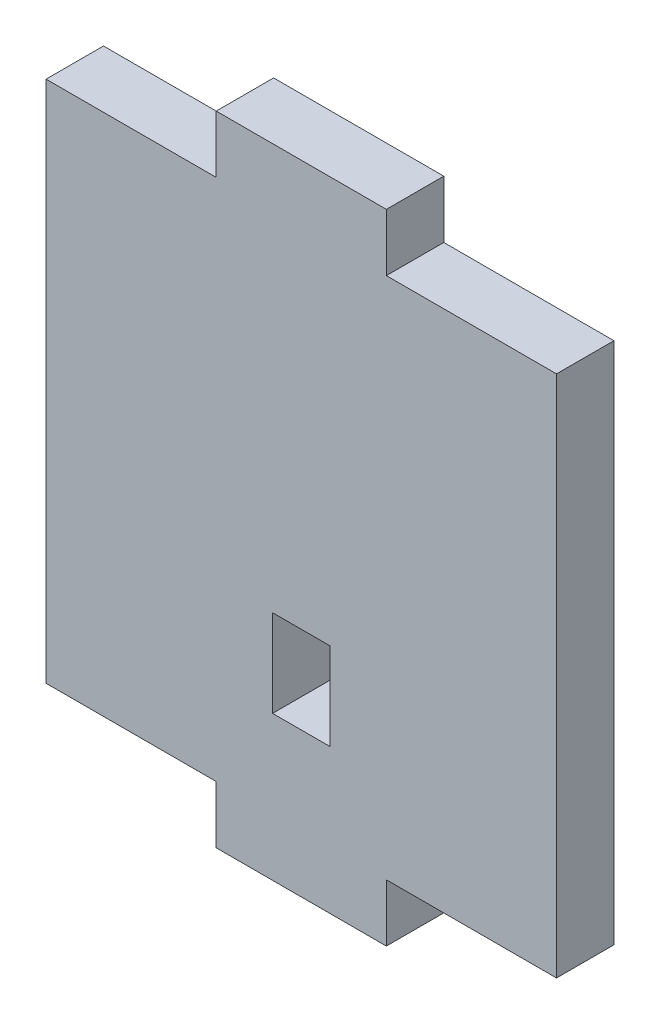
ISO-10303-21;
HEADER;
FILE_DESCRIPTION(('STEP AP214'),'2;1');
FILE_NAME('part.step','',(''),(''),'','','');
FILE_SCHEMA(('AUTOMOTIVE_DESIGN { 1 0 10303 214 1 1 1 1 }'));
ENDSEC;
DATA;
#1=APPLICATION_CONTEXT('core data for automotive mechanical design processes');
#2=APPLICATION_PROTOCOL_DEFINITION('international standard','automotive_design',2000,#1);
#3=PRODUCT_CONTEXT('',#1,'mechanical');
#4=PRODUCT('Part','Part','',(#3));
#5=PRODUCT_RELATED_PRODUCT_CATEGORY('part','',(#4));
#6=PRODUCT_DEFINITION_FORMATION('','',#4);
#7=PRODUCT_DEFINITION_CONTEXT('part definition',#1,'design');
#8=PRODUCT_DEFINITION('design','',#6,#7);
#9=PRODUCT_DEFINITION_SHAPE('','',#8);
#10=(LENGTH_UNIT() NAMED_UNIT(*) SI_UNIT(.MILLI.,.METRE.));
#11=(NAMED_UNIT(*) PLANE_ANGLE_UNIT() SI_UNIT($,.RADIAN.));
#12=(NAMED_UNIT(*) SI_UNIT($,.STERADIAN.) SOLID_ANGLE_UNIT());
#13=UNCERTAINTY_MEASURE_WITH_UNIT(LENGTH_MEASURE(1.E-05),#10,'distance_accuracy_value','');
#14=(GEOMETRIC_REPRESENTATION_CONTEXT(3) GLOBAL_UNCERTAINTY_ASSIGNED_CONTEXT((#13)) GLOBAL_UNIT_ASSIGNED_CONTEXT((#10,
#11,#12)) REPRESENTATION_CONTEXT('',''));
#15=CARTESIAN_POINT('',(0.,0.,0.));
#16=DIRECTION('',(0.,0.,1.));
#17=DIRECTION('',(1.,0.,0.));
#18=AXIS2_PLACEMENT_3D('',#15,#16,#17);
#19=CARTESIAN_POINT('',(0.,36.3333333333334,9.00000000000001));
#20=DIRECTION('',(0.,1.,0.));
#21=DIRECTION('',(0.,0.,1.));
#22=AXIS2_PLACEMENT_3D('',#19,#20,#21);
#23=PLANE('',#22);
#24=DIRECTION('',(1.,0.,0.));
#25=VECTOR('',#24,1.);
#26=CARTESIAN_POINT('',(0.,36.3333333333334,0.));
#27=LINE('',#26,#25);
#28=CARTESIAN_POINT('',(35.5000000000001,36.3333333333334,0.));
#29=VERTEX_POINT('',#28);
#30=CARTESIAN_POINT('',(44.5000000000001,36.3333333333334,0.));
#31=VERTEX_POINT('',#30);
#32=EDGE_CURVE('E232',#29,#31,#27,.T.);
#33=ORIENTED_EDGE('',*,*,#32,.T.);
#34=DIRECTION('',(0.,0.,-1.));
#35=VECTOR('',#34,1.);
#36=CARTESIAN_POINT('',(44.5000000000001,36.3333333333334,9.00000000000001));
#37=LINE('',#36,#35);
#38=CARTESIAN_POINT('',(44.5000000000001,36.3333333333334,9.00000000000001));
#39=VERTEX_POINT('',#38);
#40=EDGE_CURVE('E11',#39,#31,#37,.T.);
#41=ORIENTED_EDGE('',*,*,#40,.F.);
#42=DIRECTION('',(1.,0.,0.));
#43=VECTOR('',#42,1.);
#44=CARTESIAN_POINT('',(0.,36.3333333333334,9.00000000000001));
#45=LINE('',#44,#43);
#46=CARTESIAN_POINT('',(35.5000000000001,36.3333333333334,9.00000000000001));
#47=VERTEX_POINT('',#46);
#48=EDGE_CURVE('E170',#47,#39,#45,.T.);
#49=ORIENTED_EDGE('',*,*,#48,.F.);
#50=DIRECTION('',(0.,0.,-1.));
#51=VECTOR('',#50,1.);
#52=CARTESIAN_POINT('',(35.5000000000001,36.3333333333334,9.00000000000001));
#53=LINE('',#52,#51);
#54=EDGE_CURVE('E62',#47,#29,#53,.T.);
#55=ORIENTED_EDGE('',*,*,#54,.T.);
#56=EDGE_LOOP('',(#33,#41,#49,#55));
#57=FACE_BOUND('',#56,.T.);
#58=ADVANCED_FACE('F42',(#57),#23,.F.);
#59=CARTESIAN_POINT('',(44.5000000000001,0.,9.00000000000001));
#60=DIRECTION('',(1.,0.,0.));
#61=DIRECTION('',(0.,0.,-1.));
#62=AXIS2_PLACEMENT_3D('',#59,#60,#61);
#63=PLANE('',#62);
#64=DIRECTION('',(0.,-1.,0.));
#65=VECTOR('',#64,1.);
#66=CARTESIAN_POINT('',(44.5000000000001,0.,0.));
#67=LINE('',#66,#65);
#68=CARTESIAN_POINT('',(44.5000000000001,22.6666666666667,0.));
#69=VERTEX_POINT('',#68);
#70=EDGE_CURVE('E177',#31,#69,#67,.T.);
#71=ORIENTED_EDGE('',*,*,#70,.T.);
#72=DIRECTION('',(0.,0.,-1.));
#73=VECTOR('',#72,1.);
#74=CARTESIAN_POINT('',(44.5000000000001,22.6666666666667,9.00000000000001));
#75=LINE('',#74,#73);
#76=CARTESIAN_POINT('',(44.5000000000001,22.6666666666667,9.00000000000001));
#77=VERTEX_POINT('',#76);
#78=EDGE_CURVE('E53',#77,#69,#75,.T.);
#79=ORIENTED_EDGE('',*,*,#78,.F.);
#80=DIRECTION('',(0.,-1.,0.));
#81=VECTOR('',#80,1.);
#82=CARTESIAN_POINT('',(44.5000000000001,0.,9.00000000000001));
#83=LINE('',#82,#81);
#84=EDGE_CURVE('E164',#39,#77,#83,.T.);
#85=ORIENTED_EDGE('',*,*,#84,.F.);
#86=ORIENTED_EDGE('',*,*,#40,.T.);
#87=EDGE_LOOP('',(#71,#79,#85,#86));
#88=FACE_BOUND('',#87,.T.);
#89=ADVANCED_FACE('F176',(#88),#63,.F.);
#90=CARTESIAN_POINT('',(0.,22.6666666666667,9.00000000000001));
#91=DIRECTION('',(0.,1.,0.));
#92=DIRECTION('',(0.,0.,1.));
#93=AXIS2_PLACEMENT_3D('',#90,#91,#92);
#94=PLANE('',#93);
#95=DIRECTION('',(1.,0.,0.));
#96=VECTOR('',#95,1.);
#97=CARTESIAN_POINT('',(0.,22.6666666666667,0.));
#98=LINE('',#97,#96);
#99=CARTESIAN_POINT('',(35.5000000000001,22.6666666666667,0.));
#100=VERTEX_POINT('',#99);
#101=EDGE_CURVE('E237',#100,#69,#98,.T.);
#102=ORIENTED_EDGE('',*,*,#101,.F.);
#103=DIRECTION('',(0.,0.,-1.));
#104=VECTOR('',#103,1.);
#105=CARTESIAN_POINT('',(35.5000000000001,22.6666666666667,9.00000000000001));
#106=LINE('',#105,#104);
#107=CARTESIAN_POINT('',(35.5000000000001,22.6666666666667,9.00000000000001));
#108=VERTEX_POINT('',#107);
#109=EDGE_CURVE('E112',#108,#100,#106,.T.);
#110=ORIENTED_EDGE('',*,*,#109,.F.);
#111=DIRECTION('',(1.,0.,0.));
#112=VECTOR('',#111,1.);
#113=CARTESIAN_POINT('',(0.,22.6666666666667,9.00000000000001));
#114=LINE('',#113,#112);
#115=EDGE_CURVE('E169',#108,#77,#114,.T.);
#116=ORIENTED_EDGE('',*,*,#115,.T.);
#117=ORIENTED_EDGE('',*,*,#78,.T.);
#118=EDGE_LOOP('',(#102,#110,#116,#117));
#119=FACE_BOUND('',#118,.T.);
#120=ADVANCED_FACE('F182',(#119),#94,.T.);
#121=CARTESIAN_POINT('',(0.,0.,9.00000000000001));
#122=DIRECTION('',(-1.,0.,0.));
#123=DIRECTION('',(0.,0.,1.));
#124=AXIS2_PLACEMENT_3D('',#121,#122,#123);
#125=PLANE('',#124);
#126=DIRECTION('',(0.,1.,0.));
#127=VECTOR('',#126,1.);
#128=CARTESIAN_POINT('',(0.,0.,0.));
#129=LINE('',#128,#127);
#130=CARTESIAN_POINT('',(0.,9.00000000000004,0.));
#131=VERTEX_POINT('',#130);
#132=CARTESIAN_POINT('',(0.,91.0000000000002,0.));
#133=VERTEX_POINT('',#132);
#134=EDGE_CURVE('E192',#131,#133,#129,.T.);
#135=ORIENTED_EDGE('',*,*,#134,.F.);
#136=DIRECTION('',(0.,0.,-1.));
#137=VECTOR('',#136,1.);
#138=CARTESIAN_POINT('',(0.,9.00000000000004,9.00000000000001));
#139=LINE('',#138,#137);
#140=CARTESIAN_POINT('',(0.,9.00000000000004,9.00000000000001));
#141=VERTEX_POINT('',#140);
#142=EDGE_CURVE('E46',#141,#131,#139,.T.);
#143=ORIENTED_EDGE('',*,*,#142,.F.);
#144=DIRECTION('',(0.,1.,0.));
#145=VECTOR('',#144,1.);
#146=CARTESIAN_POINT('',(0.,0.,9.00000000000001));
#147=LINE('',#146,#145);
#148=CARTESIAN_POINT('',(0.,91.0000000000002,9.00000000000001));
#149=VERTEX_POINT('',#148);
#150=EDGE_CURVE('E244',#141,#149,#147,.T.);
#151=ORIENTED_EDGE('',*,*,#150,.T.);
#152=DIRECTION('',(0.,0.,-1.));
#153=VECTOR('',#152,1.);
#154=CARTESIAN_POINT('',(0.,91.0000000000002,9.00000000000001));
#155=LINE('',#154,#153);
#156=EDGE_CURVE('E188',#149,#133,#155,.T.);
#157=ORIENTED_EDGE('',*,*,#156,.T.);
#158=EDGE_LOOP('',(#135,#143,#151,#157));
#159=FACE_BOUND('',#158,.T.);
#160=ADVANCED_FACE('F44',(#159),#125,.T.);
#161=CARTESIAN_POINT('',(0.,9.00000000000004,9.00000000000001));
#162=DIRECTION('',(0.,1.,0.));
#163=DIRECTION('',(-1.,0.,0.));
#164=AXIS2_PLACEMENT_3D('',#161,#162,#163);
#165=PLANE('',#164);
#166=DIRECTION('',(1.,0.,0.));
#167=VECTOR('',#166,1.);
#168=CARTESIAN_POINT('',(0.,9.00000000000004,0.));
#169=LINE('',#168,#167);
#170=CARTESIAN_POINT('',(26.6666666666667,9.00000000000002,0.));
#171=VERTEX_POINT('',#170);
#172=EDGE_CURVE('E196',#131,#171,#169,.T.);
#173=ORIENTED_EDGE('',*,*,#172,.T.);
#174=DIRECTION('',(0.,0.,-1.));
#175=VECTOR('',#174,1.);
#176=CARTESIAN_POINT('',(26.6666666666667,9.00000000000002,9.00000000000001));
#177=LINE('',#176,#175);
#178=CARTESIAN_POINT('',(26.6666666666667,9.00000000000002,9.00000000000001));
#179=VERTEX_POINT('',#178);
#180=EDGE_CURVE('E280',#179,#171,#177,.T.);
#181=ORIENTED_EDGE('',*,*,#180,.F.);
#182=DIRECTION('',(1.,0.,0.));
#183=VECTOR('',#182,1.);
#184=CARTESIAN_POINT('',(0.,9.00000000000004,9.00000000000001));
#185=LINE('',#184,#183);
#186=EDGE_CURVE('E292',#141,#179,#185,.T.);
#187=ORIENTED_EDGE('',*,*,#186,.F.);
#188=ORIENTED_EDGE('',*,*,#142,.T.);
#189=EDGE_LOOP('',(#173,#181,#187,#188));
#190=FACE_BOUND('',#189,.T.);
#191=ADVANCED_FACE('F291',(#190),#165,.F.);
#192=CARTESIAN_POINT('',(26.6666666666667,0.,9.00000000000001));
#193=DIRECTION('',(-1.,0.,0.));
#194=DIRECTION('',(0.,0.,1.));
#195=AXIS2_PLACEMENT_3D('',#192,#193,#194);
#196=PLANE('',#195);
#197=DIRECTION('',(0.,1.,0.));
#198=VECTOR('',#197,1.);
#199=CARTESIAN_POINT('',(26.6666666666667,0.,0.));
#200=LINE('',#199,#198);
#201=CARTESIAN_POINT('',(26.6666666666667,0.,0.));
#202=VERTEX_POINT('',#201);
#203=EDGE_CURVE('E200',#202,#171,#200,.T.);
#204=ORIENTED_EDGE('',*,*,#203,.F.);
#205=DIRECTION('',(0.,0.,-1.));
#206=VECTOR('',#205,1.);
#207=CARTESIAN_POINT('',(26.6666666666667,0.,9.00000000000001));
#208=LINE('',#207,#206);
#209=CARTESIAN_POINT('',(26.6666666666667,0.,9.00000000000001));
#210=VERTEX_POINT('',#209);
#211=EDGE_CURVE('E278',#210,#202,#208,.T.);
#212=ORIENTED_EDGE('',*,*,#211,.F.);
#213=DIRECTION('',(0.,1.,0.));
#214=VECTOR('',#213,1.);
#215=CARTESIAN_POINT('',(26.6666666666667,0.,9.00000000000001));
#216=LINE('',#215,#214);
#217=EDGE_CURVE('E554',#210,#179,#216,.T.);
#218=ORIENTED_EDGE('',*,*,#217,.T.);
#219=ORIENTED_EDGE('',*,*,#180,.T.);
#220=EDGE_LOOP('',(#204,#212,#218,#219));
#221=FACE_BOUND('',#220,.T.);
#222=ADVANCED_FACE('F498',(#221),#196,.T.);
#223=CARTESIAN_POINT('',(0.,0.,9.00000000000001));
#224=DIRECTION('',(0.,1.,0.));
#225=DIRECTION('',(0.,0.,1.));
#226=AXIS2_PLACEMENT_3D('',#223,#224,#225);
#227=PLANE('',#226);
#228=DIRECTION('',(1.,0.,0.));
#229=VECTOR('',#228,1.);
#230=CARTESIAN_POINT('',(0.,0.,0.));
#231=LINE('',#230,#229);
#232=CARTESIAN_POINT('',(53.3333333333335,0.,0.));
#233=VERTEX_POINT('',#232);
#234=EDGE_CURVE('E205',#202,#233,#231,.T.);
#235=ORIENTED_EDGE('',*,*,#234,.T.);
#236=DIRECTION('',(0.,0.,-1.));
#237=VECTOR('',#236,1.);
#238=CARTESIAN_POINT('',(53.3333333333335,0.,9.00000000000001));
#239=LINE('',#238,#237);
#240=CARTESIAN_POINT('',(53.3333333333335,0.,9.00000000000001));
#241=VERTEX_POINT('',#240);
#242=EDGE_CURVE('E274',#241,#233,#239,.T.);
#243=ORIENTED_EDGE('',*,*,#242,.F.);
#244=DIRECTION('',(1.,0.,0.));
#245=VECTOR('',#244,1.);
#246=CARTESIAN_POINT('',(0.,0.,9.00000000000001));
#247=LINE('',#246,#245);
#248=EDGE_CURVE('E556',#210,#241,#247,.T.);
#249=ORIENTED_EDGE('',*,*,#248,.F.);
#250=ORIENTED_EDGE('',*,*,#211,.T.);
#251=EDGE_LOOP('',(#235,#243,#249,#250));
#252=FACE_BOUND('',#251,.T.);
#253=ADVANCED_FACE('F488',(#252),#227,.F.);
#254=CARTESIAN_POINT('',(53.3333333333335,0.,9.00000000000001));
#255=DIRECTION('',(-1.,0.,0.));
#256=DIRECTION('',(0.,0.,1.));
#257=AXIS2_PLACEMENT_3D('',#254,#255,#256);
#258=PLANE('',#257);
#259=DIRECTION('',(0.,1.,0.));
#260=VECTOR('',#259,1.);
#261=CARTESIAN_POINT('',(53.3333333333335,0.,0.));
#262=LINE('',#261,#260);
#263=CARTESIAN_POINT('',(53.3333333333335,9.00000000000003,0.));
#264=VERTEX_POINT('',#263);
#265=EDGE_CURVE('E208',#233,#264,#262,.T.);
#266=ORIENTED_EDGE('',*,*,#265,.T.);
#267=DIRECTION('',(0.,0.,-1.));
#268=VECTOR('',#267,1.);
#269=CARTESIAN_POINT('',(53.3333333333335,9.00000000000003,9.00000000000001));
#270=LINE('',#269,#268);
#271=CARTESIAN_POINT('',(53.3333333333335,9.00000000000003,9.00000000000001));
#272=VERTEX_POINT('',#271);
#273=EDGE_CURVE('E270',#272,#264,#270,.T.);
#274=ORIENTED_EDGE('',*,*,#273,.F.);
#275=DIRECTION('',(0.,1.,0.));
#276=VECTOR('',#275,1.);
#277=CARTESIAN_POINT('',(53.3333333333335,0.,9.00000000000001));
#278=LINE('',#277,#276);
#279=EDGE_CURVE('E559',#241,#272,#278,.T.);
#280=ORIENTED_EDGE('',*,*,#279,.F.);
#281=ORIENTED_EDGE('',*,*,#242,.T.);
#282=EDGE_LOOP('',(#266,#274,#280,#281));
#283=FACE_BOUND('',#282,.T.);
#284=ADVANCED_FACE('F478',(#283),#258,.F.);
#285=CARTESIAN_POINT('',(80.0000000000003,9.00000000000003,0.));
#286=VERTEX_POINT('',#285);
#287=EDGE_CURVE('E201',#264,#286,#169,.T.);
#288=ORIENTED_EDGE('',*,*,#287,.T.);
#289=DIRECTION('',(0.,0.,-1.));
#290=VECTOR('',#289,1.);
#291=CARTESIAN_POINT('',(80.0000000000003,9.00000000000003,9.00000000000001));
#292=LINE('',#291,#290);
#293=CARTESIAN_POINT('',(80.0000000000003,9.00000000000003,9.00000000000001));
#294=VERTEX_POINT('',#293);
#295=EDGE_CURVE('E266',#294,#286,#292,.T.);
#296=ORIENTED_EDGE('',*,*,#295,.F.);
#297=EDGE_CURVE('E353',#272,#294,#185,.T.);
#298=ORIENTED_EDGE('',*,*,#297,.F.);
#299=ORIENTED_EDGE('',*,*,#273,.T.);
#300=EDGE_LOOP('',(#288,#296,#298,#299));
#301=FACE_BOUND('',#300,.T.);
#302=ADVANCED_FACE('F325',(#301),#165,.F.);
#303=CARTESIAN_POINT('',(80.0000000000002,0.,9.00000000000001));
#304=DIRECTION('',(-1.,0.,0.));
#305=DIRECTION('',(0.,0.,1.));
#306=AXIS2_PLACEMENT_3D('',#303,#304,#305);
#307=PLANE('',#306);
#308=DIRECTION('',(0.,1.,0.));
#309=VECTOR('',#308,1.);
#310=CARTESIAN_POINT('',(80.0000000000002,0.,0.));
#311=LINE('',#310,#309);
#312=CARTESIAN_POINT('',(80.0000000000003,91.0000000000002,0.));
#313=VERTEX_POINT('',#312);
#314=EDGE_CURVE('E211',#286,#313,#311,.T.);
#315=ORIENTED_EDGE('',*,*,#314,.T.);
#316=DIRECTION('',(0.,0.,-1.));
#317=VECTOR('',#316,1.);
#318=CARTESIAN_POINT('',(80.0000000000003,91.0000000000002,9.00000000000001));
#319=LINE('',#318,#317);
#320=CARTESIAN_POINT('',(80.0000000000003,91.0000000000002,9.00000000000001));
#321=VERTEX_POINT('',#320);
#322=EDGE_CURVE('E263',#321,#313,#319,.T.);
#323=ORIENTED_EDGE('',*,*,#322,.F.);
#324=DIRECTION('',(0.,1.,0.));
#325=VECTOR('',#324,1.);
#326=CARTESIAN_POINT('',(80.0000000000002,0.,9.00000000000001));
#327=LINE('',#326,#325);
#328=EDGE_CURVE('E334',#294,#321,#327,.T.);
#329=ORIENTED_EDGE('',*,*,#328,.F.);
#330=ORIENTED_EDGE('',*,*,#295,.T.);
#331=EDGE_LOOP('',(#315,#323,#329,#330));
#332=FACE_BOUND('',#331,.T.);
#333=ADVANCED_FACE('F332',(#332),#307,.F.);
#334=CARTESIAN_POINT('',(0.,91.0000000000002,9.00000000000001));
#335=DIRECTION('',(0.,1.,0.));
#336=DIRECTION('',(0.,0.,1.));
#337=AXIS2_PLACEMENT_3D('',#334,#335,#336);
#338=PLANE('',#337);
#339=DIRECTION('',(1.,0.,0.));
#340=VECTOR('',#339,1.);
#341=CARTESIAN_POINT('',(0.,91.0000000000002,0.));
#342=LINE('',#341,#340);
#343=CARTESIAN_POINT('',(53.3333333333335,91.0000000000002,0.));
#344=VERTEX_POINT('',#343);
#345=EDGE_CURVE('E215',#344,#313,#342,.T.);
#346=ORIENTED_EDGE('',*,*,#345,.F.);
#347=DIRECTION('',(0.,0.,-1.));
#348=VECTOR('',#347,1.);
#349=CARTESIAN_POINT('',(53.3333333333335,91.0000000000002,9.00000000000001));
#350=LINE('',#349,#348);
#351=CARTESIAN_POINT('',(53.3333333333335,91.0000000000002,9.00000000000001));
#352=VERTEX_POINT('',#351);
#353=EDGE_CURVE('E260',#352,#344,#350,.T.);
#354=ORIENTED_EDGE('',*,*,#353,.F.);
#355=DIRECTION('',(1.,0.,0.));
#356=VECTOR('',#355,1.);
#357=CARTESIAN_POINT('',(0.,91.0000000000002,9.00000000000001));
#358=LINE('',#357,#356);
#359=EDGE_CURVE('E341',#352,#321,#358,.T.);
#360=ORIENTED_EDGE('',*,*,#359,.T.);
#361=ORIENTED_EDGE('',*,*,#322,.T.);
#362=EDGE_LOOP('',(#346,#354,#360,#361));
#363=FACE_BOUND('',#362,.T.);
#364=ADVANCED_FACE('F338',(#363),#338,.T.);
#365=CARTESIAN_POINT('',(53.3333333333335,0.,9.00000000000001));
#366=DIRECTION('',(1.,0.,0.));
#367=DIRECTION('',(0.,0.,-1.));
#368=AXIS2_PLACEMENT_3D('',#365,#366,#367);
#369=PLANE('',#368);
#370=DIRECTION('',(0.,-1.,0.));
#371=VECTOR('',#370,1.);
#372=CARTESIAN_POINT('',(53.3333333333335,0.,0.));
#373=LINE('',#372,#371);
#374=CARTESIAN_POINT('',(53.3333333333335,100.,0.));
#375=VERTEX_POINT('',#374);
#376=EDGE_CURVE('E219',#375,#344,#373,.T.);
#377=ORIENTED_EDGE('',*,*,#376,.F.);
#378=DIRECTION('',(0.,0.,-1.));
#379=VECTOR('',#378,1.);
#380=CARTESIAN_POINT('',(53.3333333333335,100.,9.00000000000001));
#381=LINE('',#380,#379);
#382=CARTESIAN_POINT('',(53.3333333333335,100.,9.00000000000001));
#383=VERTEX_POINT('',#382);
#384=EDGE_CURVE('E257',#383,#375,#381,.T.);
#385=ORIENTED_EDGE('',*,*,#384,.F.);
#386=DIRECTION('',(0.,-1.,0.));
#387=VECTOR('',#386,1.);
#388=CARTESIAN_POINT('',(53.3333333333335,0.,9.00000000000001));
#389=LINE('',#388,#387);
#390=EDGE_CURVE('E346',#383,#352,#389,.T.);
#391=ORIENTED_EDGE('',*,*,#390,.T.);
#392=ORIENTED_EDGE('',*,*,#353,.T.);
#393=EDGE_LOOP('',(#377,#385,#391,#392));
#394=FACE_BOUND('',#393,.T.);
#395=ADVANCED_FACE('F372',(#394),#369,.T.);
#396=CARTESIAN_POINT('',(0.,100.,9.00000000000001));
#397=DIRECTION('',(0.,1.,0.));
#398=DIRECTION('',(0.,0.,1.));
#399=AXIS2_PLACEMENT_3D('',#396,#397,#398);
#400=PLANE('',#399);
#401=DIRECTION('',(1.,0.,0.));
#402=VECTOR('',#401,1.);
#403=CARTESIAN_POINT('',(0.,100.,0.));
#404=LINE('',#403,#402);
#405=CARTESIAN_POINT('',(26.6666666666668,100.,0.));
#406=VERTEX_POINT('',#405);
#407=EDGE_CURVE('E224',#406,#375,#404,.T.);
#408=ORIENTED_EDGE('',*,*,#407,.F.);
#409=DIRECTION('',(0.,0.,-1.));
#410=VECTOR('',#409,1.);
#411=CARTESIAN_POINT('',(26.6666666666668,100.,9.00000000000001));
#412=LINE('',#411,#410);
#413=CARTESIAN_POINT('',(26.6666666666668,100.,9.00000000000001));
#414=VERTEX_POINT('',#413);
#415=EDGE_CURVE('E254',#414,#406,#412,.T.);
#416=ORIENTED_EDGE('',*,*,#415,.F.);
#417=DIRECTION('',(1.,0.,0.));
#418=VECTOR('',#417,1.);
#419=CARTESIAN_POINT('',(0.,100.,9.00000000000001));
#420=LINE('',#419,#418);
#421=EDGE_CURVE('E351',#414,#383,#420,.T.);
#422=ORIENTED_EDGE('',*,*,#421,.T.);
#423=ORIENTED_EDGE('',*,*,#384,.T.);
#424=EDGE_LOOP('',(#408,#416,#422,#423));
#425=FACE_BOUND('',#424,.T.);
#426=ADVANCED_FACE('F370',(#425),#400,.T.);
#427=CARTESIAN_POINT('',(26.6666666666667,0.,9.00000000000001));
#428=DIRECTION('',(1.,0.,0.));
#429=DIRECTION('',(0.,0.,-1.));
#430=AXIS2_PLACEMENT_3D('',#427,#428,#429);
#431=PLANE('',#430);
#432=DIRECTION('',(0.,-1.,0.));
#433=VECTOR('',#432,1.);
#434=CARTESIAN_POINT('',(26.6666666666667,0.,0.));
#435=LINE('',#434,#433);
#436=CARTESIAN_POINT('',(26.6666666666667,91.0000000000002,0.));
#437=VERTEX_POINT('',#436);
#438=EDGE_CURVE('E228',#406,#437,#435,.T.);
#439=ORIENTED_EDGE('',*,*,#438,.T.);
#440=DIRECTION('',(0.,0.,-1.));
#441=VECTOR('',#440,1.);
#442=CARTESIAN_POINT('',(26.6666666666667,91.0000000000002,9.00000000000001));
#443=LINE('',#442,#441);
#444=CARTESIAN_POINT('',(26.6666666666667,91.0000000000002,9.00000000000001));
#445=VERTEX_POINT('',#444);
#446=EDGE_CURVE('E251',#445,#437,#443,.T.);
#447=ORIENTED_EDGE('',*,*,#446,.F.);
#448=DIRECTION('',(0.,-1.,0.));
#449=VECTOR('',#448,1.);
#450=CARTESIAN_POINT('',(26.6666666666667,0.,9.00000000000001));
#451=LINE('',#450,#449);
#452=EDGE_CURVE('E356',#414,#445,#451,.T.);
#453=ORIENTED_EDGE('',*,*,#452,.F.);
#454=ORIENTED_EDGE('',*,*,#415,.T.);
#455=EDGE_LOOP('',(#439,#447,#453,#454));
#456=FACE_BOUND('',#455,.T.);
#457=ADVANCED_FACE('F374',(#456),#431,.F.);
#458=EDGE_CURVE('E220',#133,#437,#342,.T.);
#459=ORIENTED_EDGE('',*,*,#458,.F.);
#460=ORIENTED_EDGE('',*,*,#156,.F.);
#461=EDGE_CURVE('E304',#149,#445,#358,.T.);
#462=ORIENTED_EDGE('',*,*,#461,.T.);
#463=ORIENTED_EDGE('',*,*,#446,.T.);
#464=EDGE_LOOP('',(#459,#460,#462,#463));
#465=FACE_BOUND('',#464,.T.);
#466=ADVANCED_FACE('F303',(#465),#338,.T.);
#467=CARTESIAN_POINT('',(35.5000000000001,0.,9.00000000000001));
#468=DIRECTION('',(1.,0.,0.));
#469=DIRECTION('',(0.,0.,-1.));
#470=AXIS2_PLACEMENT_3D('',#467,#468,#469);
#471=PLANE('',#470);
#472=DIRECTION('',(0.,-1.,0.));
#473=VECTOR('',#472,1.);
#474=CARTESIAN_POINT('',(35.5000000000001,0.,0.));
#475=LINE('',#474,#473);
#476=EDGE_CURVE('E240',#29,#100,#475,.T.);
#477=ORIENTED_EDGE('',*,*,#476,.F.);
#478=ORIENTED_EDGE('',*,*,#54,.F.);
#479=DIRECTION('',(0.,-1.,0.));
#480=VECTOR('',#479,1.);
#481=CARTESIAN_POINT('',(35.5000000000001,0.,9.00000000000001));
#482=LINE('',#481,#480);
#483=EDGE_CURVE('E184',#47,#108,#482,.T.);
#484=ORIENTED_EDGE('',*,*,#483,.T.);
#485=ORIENTED_EDGE('',*,*,#109,.T.);
#486=EDGE_LOOP('',(#477,#478,#484,#485));
#487=FACE_BOUND('',#486,.T.);
#488=ADVANCED_FACE('F381',(#487),#471,.T.);
#489=CARTESIAN_POINT('',(0.,0.,9.00000000000001));
#490=DIRECTION('',(0.,0.,1.));
#491=DIRECTION('',(1.,0.,0.));
#492=AXIS2_PLACEMENT_3D('',#489,#490,#491);
#493=PLANE('',#492);
#494=ORIENTED_EDGE('',*,*,#150,.F.);
#495=ORIENTED_EDGE('',*,*,#186,.T.);
#496=ORIENTED_EDGE('',*,*,#217,.F.);
#497=ORIENTED_EDGE('',*,*,#248,.T.);
#498=ORIENTED_EDGE('',*,*,#279,.T.);
#499=ORIENTED_EDGE('',*,*,#297,.T.);
#500=ORIENTED_EDGE('',*,*,#328,.T.);
#501=ORIENTED_EDGE('',*,*,#359,.F.);
#502=ORIENTED_EDGE('',*,*,#390,.F.);
#503=ORIENTED_EDGE('',*,*,#421,.F.);
#504=ORIENTED_EDGE('',*,*,#452,.T.);
#505=ORIENTED_EDGE('',*,*,#461,.F.);
#506=EDGE_LOOP('',(#494,#495,#496,#497,#498,#499,#500,#501,#502,#503,#504,#505));
#507=FACE_BOUND('',#506,.T.);
#508=ORIENTED_EDGE('',*,*,#48,.T.);
#509=ORIENTED_EDGE('',*,*,#84,.T.);
#510=ORIENTED_EDGE('',*,*,#115,.F.);
#511=ORIENTED_EDGE('',*,*,#483,.F.);
#512=EDGE_LOOP('',(#508,#509,#510,#511));
#513=FACE_BOUND('',#512,.T.);
#514=ADVANCED_FACE('F166',(#507,#513),#493,.T.);
#515=CARTESIAN_POINT('',(0.,0.,0.));
#516=DIRECTION('',(0.,0.,1.));
#517=DIRECTION('',(1.,0.,0.));
#518=AXIS2_PLACEMENT_3D('',#515,#516,#517);
#519=PLANE('',#518);
#520=ORIENTED_EDGE('',*,*,#134,.T.);
#521=ORIENTED_EDGE('',*,*,#458,.T.);
#522=ORIENTED_EDGE('',*,*,#438,.F.);
#523=ORIENTED_EDGE('',*,*,#407,.T.);
#524=ORIENTED_EDGE('',*,*,#376,.T.);
#525=ORIENTED_EDGE('',*,*,#345,.T.);
#526=ORIENTED_EDGE('',*,*,#314,.F.);
#527=ORIENTED_EDGE('',*,*,#287,.F.);
#528=ORIENTED_EDGE('',*,*,#265,.F.);
#529=ORIENTED_EDGE('',*,*,#234,.F.);
#530=ORIENTED_EDGE('',*,*,#203,.T.);
#531=ORIENTED_EDGE('',*,*,#172,.F.);
#532=EDGE_LOOP('',(#520,#521,#522,#523,#524,#525,#526,#527,#528,#529,#530,#531));
#533=FACE_BOUND('',#532,.T.);
#534=ORIENTED_EDGE('',*,*,#32,.F.);
#535=ORIENTED_EDGE('',*,*,#476,.T.);
#536=ORIENTED_EDGE('',*,*,#101,.T.);
#537=ORIENTED_EDGE('',*,*,#70,.F.);
#538=EDGE_LOOP('',(#534,#535,#536,#537));
#539=FACE_BOUND('',#538,.T.);
#540=ADVANCED_FACE('F295',(#533,#539),#519,.F.);
#541=CLOSED_SHELL('',(#58,#89,#120,#160,#191,#222,#253,#284,#302,#333,#364,#395,#426,#457,#466,
#488,#514,#540));
#542=MANIFOLD_SOLID_BREP('B2',#541);
#543=ADVANCED_BREP_SHAPE_REPRESENTATION('',(#18,#542),#14);
#544=SHAPE_DEFINITION_REPRESENTATION(#9,#543);
ENDSEC;
END-ISO-10303-21;
